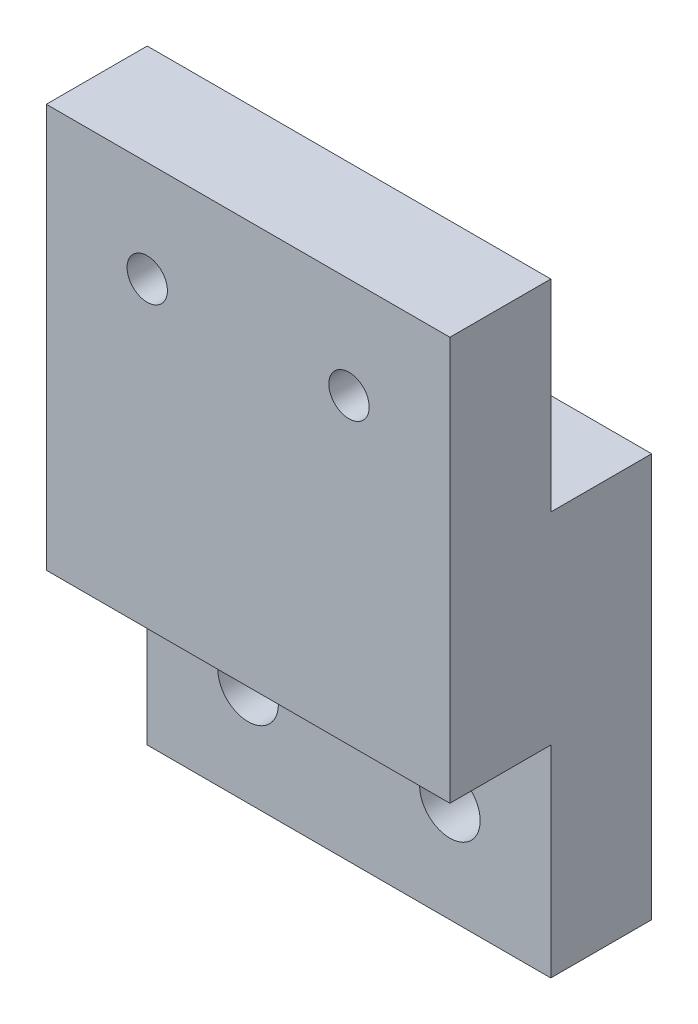
ISO-10303-21;
HEADER;
FILE_DESCRIPTION(('STEP AP214'),'2;1');
FILE_NAME('part.step','',(''),(''),'','','');
FILE_SCHEMA(('AUTOMOTIVE_DESIGN { 1 0 10303 214 1 1 1 1 }'));
ENDSEC;
DATA;
#1=APPLICATION_CONTEXT('core data for automotive mechanical design processes');
#2=APPLICATION_PROTOCOL_DEFINITION('international standard','automotive_design',2000,#1);
#3=PRODUCT_CONTEXT('',#1,'mechanical');
#4=PRODUCT('Part','Part','',(#3));
#5=PRODUCT_RELATED_PRODUCT_CATEGORY('part','',(#4));
#6=PRODUCT_DEFINITION_FORMATION('','',#4);
#7=PRODUCT_DEFINITION_CONTEXT('part definition',#1,'design');
#8=PRODUCT_DEFINITION('design','',#6,#7);
#9=PRODUCT_DEFINITION_SHAPE('','',#8);
#10=(LENGTH_UNIT() NAMED_UNIT(*) SI_UNIT(.MILLI.,.METRE.));
#11=(NAMED_UNIT(*) PLANE_ANGLE_UNIT() SI_UNIT($,.RADIAN.));
#12=(NAMED_UNIT(*) SI_UNIT($,.STERADIAN.) SOLID_ANGLE_UNIT());
#13=UNCERTAINTY_MEASURE_WITH_UNIT(LENGTH_MEASURE(1.E-05),#10,'distance_accuracy_value','');
#14=(GEOMETRIC_REPRESENTATION_CONTEXT(3) GLOBAL_UNCERTAINTY_ASSIGNED_CONTEXT((#13)) GLOBAL_UNIT_ASSIGNED_CONTEXT((#10,
#11,#12)) REPRESENTATION_CONTEXT('',''));
#15=CARTESIAN_POINT('',(0.,0.,0.));
#16=DIRECTION('',(0.,0.,1.));
#17=DIRECTION('',(1.,0.,0.));
#18=AXIS2_PLACEMENT_3D('',#15,#16,#17);
#19=CARTESIAN_POINT('',(-9.99999999999999,5.,5.));
#20=DIRECTION('',(1.,0.,0.));
#21=DIRECTION('',(0.,1.,0.));
#22=AXIS2_PLACEMENT_3D('',#19,#20,#21);
#23=PLANE('',#22);
#24=DIRECTION('',(0.,-1.,0.));
#25=VECTOR('',#24,1.);
#26=CARTESIAN_POINT('',(-9.99999999999999,5.,0.));
#27=LINE('',#26,#25);
#28=CARTESIAN_POINT('',(-9.99999999999999,5.,0.));
#29=VERTEX_POINT('',#28);
#30=CARTESIAN_POINT('',(-9.99999999999999,-5.,0.));
#31=VERTEX_POINT('',#30);
#32=EDGE_CURVE('E171',#29,#31,#27,.T.);
#33=ORIENTED_EDGE('',*,*,#32,.T.);
#34=DIRECTION('',(0.,0.,1.));
#35=VECTOR('',#34,1.);
#36=CARTESIAN_POINT('',(-9.99999999999999,-5.,-5.));
#37=LINE('',#36,#35);
#38=CARTESIAN_POINT('',(-9.99999999999999,-5.,-5.));
#39=VERTEX_POINT('',#38);
#40=EDGE_CURVE('E106',#39,#31,#37,.T.);
#41=ORIENTED_EDGE('',*,*,#40,.F.);
#42=DIRECTION('',(0.,1.,0.));
#43=VECTOR('',#42,1.);
#44=CARTESIAN_POINT('',(-9.99999999999999,-15.,-5.));
#45=LINE('',#44,#43);
#46=CARTESIAN_POINT('',(-9.99999999999998,-25.,-5.));
#47=VERTEX_POINT('',#46);
#48=EDGE_CURVE('E100',#47,#39,#45,.T.);
#49=ORIENTED_EDGE('',*,*,#48,.F.);
#50=DIRECTION('',(0.,0.,-1.));
#51=VECTOR('',#50,1.);
#52=CARTESIAN_POINT('',(-9.99999999999998,-25.,-5.));
#53=LINE('',#52,#51);
#54=CARTESIAN_POINT('',(-9.99999999999998,-25.,0.));
#55=VERTEX_POINT('',#54);
#56=EDGE_CURVE('E104',#55,#47,#53,.T.);
#57=ORIENTED_EDGE('',*,*,#56,.F.);
#58=DIRECTION('',(0.,1.,0.));
#59=VECTOR('',#58,1.);
#60=CARTESIAN_POINT('',(-9.99999999999998,-25.,0.));
#61=LINE('',#60,#59);
#62=CARTESIAN_POINT('',(-9.99999999999999,-15.,0.));
#63=VERTEX_POINT('',#62);
#64=EDGE_CURVE('E131',#55,#63,#61,.T.);
#65=ORIENTED_EDGE('',*,*,#64,.T.);
#66=DIRECTION('',(0.,0.,-1.));
#67=VECTOR('',#66,1.);
#68=CARTESIAN_POINT('',(-9.99999999999999,-15.,5.));
#69=LINE('',#68,#67);
#70=CARTESIAN_POINT('',(-9.99999999999999,-15.,5.));
#71=VERTEX_POINT('',#70);
#72=EDGE_CURVE('E160',#71,#63,#69,.T.);
#73=ORIENTED_EDGE('',*,*,#72,.F.);
#74=DIRECTION('',(0.,-1.,0.));
#75=VECTOR('',#74,1.);
#76=CARTESIAN_POINT('',(-9.99999999999999,5.,5.));
#77=LINE('',#76,#75);
#78=CARTESIAN_POINT('',(-9.99999999999999,5.,5.));
#79=VERTEX_POINT('',#78);
#80=EDGE_CURVE('E172',#79,#71,#77,.T.);
#81=ORIENTED_EDGE('',*,*,#80,.F.);
#82=DIRECTION('',(0.,0.,-1.));
#83=VECTOR('',#82,1.);
#84=CARTESIAN_POINT('',(-9.99999999999999,5.,5.));
#85=LINE('',#84,#83);
#86=EDGE_CURVE('E40',#79,#29,#85,.T.);
#87=ORIENTED_EDGE('',*,*,#86,.T.);
#88=EDGE_LOOP('',(#33,#41,#49,#57,#65,#73,#81,#87));
#89=FACE_BOUND('',#88,.T.);
#90=ADVANCED_FACE('F32',(#89),#23,.F.);
#91=CARTESIAN_POINT('',(10.,5.,5.));
#92=DIRECTION('',(-1.,0.,0.));
#93=DIRECTION('',(0.,-1.,0.));
#94=AXIS2_PLACEMENT_3D('',#91,#92,#93);
#95=PLANE('',#94);
#96=DIRECTION('',(0.,0.,1.));
#97=VECTOR('',#96,1.);
#98=CARTESIAN_POINT('',(10.,-15.,5.));
#99=LINE('',#98,#97);
#100=CARTESIAN_POINT('',(10.,-15.,0.));
#101=VERTEX_POINT('',#100);
#102=CARTESIAN_POINT('',(10.,-15.,5.));
#103=VERTEX_POINT('',#102);
#104=EDGE_CURVE('E138',#101,#103,#99,.T.);
#105=ORIENTED_EDGE('',*,*,#104,.F.);
#106=DIRECTION('',(0.,1.,0.));
#107=VECTOR('',#106,1.);
#108=CARTESIAN_POINT('',(10.,-25.,0.));
#109=LINE('',#108,#107);
#110=CARTESIAN_POINT('',(10.,-25.,0.));
#111=VERTEX_POINT('',#110);
#112=EDGE_CURVE('E142',#111,#101,#109,.T.);
#113=ORIENTED_EDGE('',*,*,#112,.F.);
#114=DIRECTION('',(0.,0.,1.));
#115=VECTOR('',#114,1.);
#116=CARTESIAN_POINT('',(10.,-25.,-5.));
#117=LINE('',#116,#115);
#118=CARTESIAN_POINT('',(10.,-25.,-5.));
#119=VERTEX_POINT('',#118);
#120=EDGE_CURVE('E117',#119,#111,#117,.T.);
#121=ORIENTED_EDGE('',*,*,#120,.F.);
#122=DIRECTION('',(0.,-1.,0.));
#123=VECTOR('',#122,1.);
#124=CARTESIAN_POINT('',(10.,-15.,-5.));
#125=LINE('',#124,#123);
#126=CARTESIAN_POINT('',(10.,-5.,-5.));
#127=VERTEX_POINT('',#126);
#128=EDGE_CURVE('E114',#127,#119,#125,.T.);
#129=ORIENTED_EDGE('',*,*,#128,.F.);
#130=DIRECTION('',(0.,0.,1.));
#131=VECTOR('',#130,1.);
#132=CARTESIAN_POINT('',(10.,-5.,-5.));
#133=LINE('',#132,#131);
#134=CARTESIAN_POINT('',(10.,-5.,0.));
#135=VERTEX_POINT('',#134);
#136=EDGE_CURVE('E189',#127,#135,#133,.T.);
#137=ORIENTED_EDGE('',*,*,#136,.T.);
#138=DIRECTION('',(0.,1.,0.));
#139=VECTOR('',#138,1.);
#140=CARTESIAN_POINT('',(10.,5.,0.));
#141=LINE('',#140,#139);
#142=CARTESIAN_POINT('',(10.,5.,0.));
#143=VERTEX_POINT('',#142);
#144=EDGE_CURVE('E185',#135,#143,#141,.T.);
#145=ORIENTED_EDGE('',*,*,#144,.T.);
#146=DIRECTION('',(0.,0.,-1.));
#147=VECTOR('',#146,1.);
#148=CARTESIAN_POINT('',(10.,5.,5.));
#149=LINE('',#148,#147);
#150=CARTESIAN_POINT('',(10.,5.,5.));
#151=VERTEX_POINT('',#150);
#152=EDGE_CURVE('E11',#151,#143,#149,.T.);
#153=ORIENTED_EDGE('',*,*,#152,.F.);
#154=DIRECTION('',(0.,1.,0.));
#155=VECTOR('',#154,1.);
#156=CARTESIAN_POINT('',(10.,5.,5.));
#157=LINE('',#156,#155);
#158=EDGE_CURVE('E174',#103,#151,#157,.T.);
#159=ORIENTED_EDGE('',*,*,#158,.F.);
#160=EDGE_LOOP('',(#105,#113,#121,#129,#137,#145,#153,#159));
#161=FACE_BOUND('',#160,.T.);
#162=ADVANCED_FACE('F200',(#161),#95,.F.);
#163=CARTESIAN_POINT('',(10.,5.,5.));
#164=DIRECTION('',(0.,-1.,0.));
#165=DIRECTION('',(1.,0.,0.));
#166=AXIS2_PLACEMENT_3D('',#163,#164,#165);
#167=PLANE('',#166);
#168=DIRECTION('',(-1.,0.,0.));
#169=VECTOR('',#168,1.);
#170=CARTESIAN_POINT('',(10.,5.,0.));
#171=LINE('',#170,#169);
#172=EDGE_CURVE('E175',#143,#29,#171,.T.);
#173=ORIENTED_EDGE('',*,*,#172,.T.);
#174=ORIENTED_EDGE('',*,*,#86,.F.);
#175=DIRECTION('',(-1.,0.,0.));
#176=VECTOR('',#175,1.);
#177=CARTESIAN_POINT('',(10.,5.,5.));
#178=LINE('',#177,#176);
#179=EDGE_CURVE('E177',#151,#79,#178,.T.);
#180=ORIENTED_EDGE('',*,*,#179,.F.);
#181=ORIENTED_EDGE('',*,*,#152,.T.);
#182=EDGE_LOOP('',(#173,#174,#180,#181));
#183=FACE_BOUND('',#182,.T.);
#184=ADVANCED_FACE('F214',(#183),#167,.F.);
#185=CARTESIAN_POINT('',(0.,0.,5.));
#186=DIRECTION('',(0.,0.,-1.));
#187=DIRECTION('',(-1.,0.,0.));
#188=AXIS2_PLACEMENT_3D('',#185,#186,#187);
#189=PLANE('',#188);
#190=CARTESIAN_POINT('',(5.00000000000001,0.,5.));
#191=DIRECTION('',(0.,0.,1.));
#192=DIRECTION('',(1.,0.,0.));
#193=AXIS2_PLACEMENT_3D('',#190,#191,#192);
#194=CIRCLE('',#193,1.);
#195=CARTESIAN_POINT('',(6.00000000000001,0.,5.));
#196=VERTEX_POINT('',#195);
#197=EDGE_CURVE('E134',#196,#196,#194,.T.);
#198=ORIENTED_EDGE('',*,*,#197,.F.);
#199=EDGE_LOOP('',(#198));
#200=FACE_BOUND('',#199,.T.);
#201=CARTESIAN_POINT('',(-4.99999999999999,0.,5.));
#202=DIRECTION('',(0.,0.,1.));
#203=DIRECTION('',(1.,0.,0.));
#204=AXIS2_PLACEMENT_3D('',#201,#202,#203);
#205=CIRCLE('',#204,1.);
#206=CARTESIAN_POINT('',(-3.99999999999999,0.,5.));
#207=VERTEX_POINT('',#206);
#208=EDGE_CURVE('E152',#207,#207,#205,.T.);
#209=ORIENTED_EDGE('',*,*,#208,.F.);
#210=EDGE_LOOP('',(#209));
#211=FACE_BOUND('',#210,.T.);
#212=ORIENTED_EDGE('',*,*,#80,.T.);
#213=DIRECTION('',(-1.,0.,0.));
#214=VECTOR('',#213,1.);
#215=CARTESIAN_POINT('',(-9.99999999999999,-15.,5.));
#216=LINE('',#215,#214);
#217=EDGE_CURVE('E168',#103,#71,#216,.T.);
#218=ORIENTED_EDGE('',*,*,#217,.F.);
#219=ORIENTED_EDGE('',*,*,#158,.T.);
#220=ORIENTED_EDGE('',*,*,#179,.T.);
#221=EDGE_LOOP('',(#212,#218,#219,#220));
#222=FACE_BOUND('',#221,.T.);
#223=ADVANCED_FACE('F209',(#200,#211,#222),#189,.F.);
#224=CARTESIAN_POINT('',(0.,0.,0.));
#225=DIRECTION('',(0.,0.,-1.));
#226=DIRECTION('',(-1.,0.,0.));
#227=AXIS2_PLACEMENT_3D('',#224,#225,#226);
#228=PLANE('',#227);
#229=CARTESIAN_POINT('',(5.00000000000001,0.,0.));
#230=DIRECTION('',(0.,0.,-1.));
#231=DIRECTION('',(-1.,0.,0.));
#232=AXIS2_PLACEMENT_3D('',#229,#230,#231);
#233=CIRCLE('',#232,1.);
#234=CARTESIAN_POINT('',(4.00000000000001,0.,0.));
#235=VERTEX_POINT('',#234);
#236=EDGE_CURVE('E148',#235,#235,#233,.T.);
#237=ORIENTED_EDGE('',*,*,#236,.F.);
#238=EDGE_LOOP('',(#237));
#239=FACE_BOUND('',#238,.T.);
#240=CARTESIAN_POINT('',(-4.99999999999999,0.,0.));
#241=DIRECTION('',(0.,0.,-1.));
#242=DIRECTION('',(-1.,0.,0.));
#243=AXIS2_PLACEMENT_3D('',#240,#241,#242);
#244=CIRCLE('',#243,1.);
#245=CARTESIAN_POINT('',(-5.99999999999999,0.,0.));
#246=VERTEX_POINT('',#245);
#247=EDGE_CURVE('E157',#246,#246,#244,.T.);
#248=ORIENTED_EDGE('',*,*,#247,.F.);
#249=EDGE_LOOP('',(#248));
#250=FACE_BOUND('',#249,.T.);
#251=DIRECTION('',(1.,0.,0.));
#252=VECTOR('',#251,1.);
#253=CARTESIAN_POINT('',(-9.99999999999999,-5.,0.));
#254=LINE('',#253,#252);
#255=EDGE_CURVE('E56',#31,#135,#254,.T.);
#256=ORIENTED_EDGE('',*,*,#255,.F.);
#257=ORIENTED_EDGE('',*,*,#32,.F.);
#258=ORIENTED_EDGE('',*,*,#172,.F.);
#259=ORIENTED_EDGE('',*,*,#144,.F.);
#260=EDGE_LOOP('',(#256,#257,#258,#259));
#261=FACE_BOUND('',#260,.T.);
#262=ADVANCED_FACE('F216',(#239,#250,#261),#228,.T.);
#263=CARTESIAN_POINT('',(0.,-15.,0.));
#264=DIRECTION('',(0.,-1.,0.));
#265=DIRECTION('',(1.,0.,0.));
#266=AXIS2_PLACEMENT_3D('',#263,#264,#265);
#267=PLANE('',#266);
#268=DIRECTION('',(-1.,0.,0.));
#269=VECTOR('',#268,1.);
#270=CARTESIAN_POINT('',(-9.99999999999999,-15.,0.));
#271=LINE('',#270,#269);
#272=EDGE_CURVE('E48',#101,#63,#271,.T.);
#273=ORIENTED_EDGE('',*,*,#272,.F.);
#274=ORIENTED_EDGE('',*,*,#104,.T.);
#275=ORIENTED_EDGE('',*,*,#217,.T.);
#276=ORIENTED_EDGE('',*,*,#72,.T.);
#277=EDGE_LOOP('',(#273,#274,#275,#276));
#278=FACE_BOUND('',#277,.T.);
#279=ADVANCED_FACE('F206',(#278),#267,.T.);
#280=CARTESIAN_POINT('',(-9.99999999999999,-5.,-5.));
#281=DIRECTION('',(0.,-1.,0.));
#282=DIRECTION('',(0.,0.,-1.));
#283=AXIS2_PLACEMENT_3D('',#280,#281,#282);
#284=PLANE('',#283);
#285=ORIENTED_EDGE('',*,*,#255,.T.);
#286=ORIENTED_EDGE('',*,*,#136,.F.);
#287=DIRECTION('',(1.,0.,0.));
#288=VECTOR('',#287,1.);
#289=CARTESIAN_POINT('',(-9.99999999999999,-5.,-5.));
#290=LINE('',#289,#288);
#291=EDGE_CURVE('E108',#39,#127,#290,.T.);
#292=ORIENTED_EDGE('',*,*,#291,.F.);
#293=ORIENTED_EDGE('',*,*,#40,.T.);
#294=EDGE_LOOP('',(#285,#286,#292,#293));
#295=FACE_BOUND('',#294,.T.);
#296=ADVANCED_FACE('F196',(#295),#284,.F.);
#297=CARTESIAN_POINT('',(0.,0.,-5.));
#298=DIRECTION('',(0.,0.,-1.));
#299=DIRECTION('',(-1.,0.,0.));
#300=AXIS2_PLACEMENT_3D('',#297,#298,#299);
#301=PLANE('',#300);
#302=CARTESIAN_POINT('',(5.,-20.,-5.));
#303=DIRECTION('',(0.,0.,-1.));
#304=DIRECTION('',(-1.,0.,0.));
#305=AXIS2_PLACEMENT_3D('',#302,#303,#304);
#306=CIRCLE('',#305,1.5);
#307=CARTESIAN_POINT('',(3.5,-20.,-5.));
#308=VERTEX_POINT('',#307);
#309=EDGE_CURVE('E345',#308,#308,#306,.T.);
#310=ORIENTED_EDGE('',*,*,#309,.F.);
#311=EDGE_LOOP('',(#310));
#312=FACE_BOUND('',#311,.T.);
#313=CARTESIAN_POINT('',(-5.,-20.,-5.));
#314=DIRECTION('',(0.,0.,-1.));
#315=DIRECTION('',(-1.,0.,0.));
#316=AXIS2_PLACEMENT_3D('',#313,#314,#315);
#317=CIRCLE('',#316,1.5);
#318=CARTESIAN_POINT('',(-6.5,-20.,-5.));
#319=VERTEX_POINT('',#318);
#320=EDGE_CURVE('E124',#319,#319,#317,.T.);
#321=ORIENTED_EDGE('',*,*,#320,.F.);
#322=EDGE_LOOP('',(#321));
#323=FACE_BOUND('',#322,.T.);
#324=ORIENTED_EDGE('',*,*,#48,.T.);
#325=ORIENTED_EDGE('',*,*,#291,.T.);
#326=ORIENTED_EDGE('',*,*,#128,.T.);
#327=DIRECTION('',(1.,0.,0.));
#328=VECTOR('',#327,1.);
#329=CARTESIAN_POINT('',(-9.99999999999998,-25.,-5.));
#330=LINE('',#329,#328);
#331=EDGE_CURVE('E111',#47,#119,#330,.T.);
#332=ORIENTED_EDGE('',*,*,#331,.F.);
#333=EDGE_LOOP('',(#324,#325,#326,#332));
#334=FACE_BOUND('',#333,.T.);
#335=ADVANCED_FACE('F112',(#312,#323,#334),#301,.T.);
#336=CARTESIAN_POINT('',(-4.99999999999999,0.,-5.));
#337=DIRECTION('',(0.,0.,1.));
#338=DIRECTION('',(1.,0.,0.));
#339=AXIS2_PLACEMENT_3D('',#336,#337,#338);
#340=CYLINDRICAL_SURFACE('',#339,1.);
#341=ORIENTED_EDGE('',*,*,#247,.T.);
#342=EDGE_LOOP('',(#341));
#343=FACE_BOUND('',#342,.T.);
#344=ORIENTED_EDGE('',*,*,#208,.T.);
#345=EDGE_LOOP('',(#344));
#346=FACE_BOUND('',#345,.T.);
#347=ADVANCED_FACE('F259',(#343,#346),#340,.F.);
#348=CARTESIAN_POINT('',(5.00000000000001,0.,-5.));
#349=DIRECTION('',(0.,0.,1.));
#350=DIRECTION('',(1.,0.,0.));
#351=AXIS2_PLACEMENT_3D('',#348,#349,#350);
#352=CYLINDRICAL_SURFACE('',#351,1.);
#353=ORIENTED_EDGE('',*,*,#236,.T.);
#354=EDGE_LOOP('',(#353));
#355=FACE_BOUND('',#354,.T.);
#356=ORIENTED_EDGE('',*,*,#197,.T.);
#357=EDGE_LOOP('',(#356));
#358=FACE_BOUND('',#357,.T.);
#359=ADVANCED_FACE('F264',(#355,#358),#352,.F.);
#360=CARTESIAN_POINT('',(-9.99999999999998,-25.,0.));
#361=DIRECTION('',(0.,0.,-1.));
#362=DIRECTION('',(-1.,0.,0.));
#363=AXIS2_PLACEMENT_3D('',#360,#361,#362);
#364=PLANE('',#363);
#365=CARTESIAN_POINT('',(5.,-20.,0.));
#366=DIRECTION('',(0.,0.,1.));
#367=DIRECTION('',(1.,0.,0.));
#368=AXIS2_PLACEMENT_3D('',#365,#366,#367);
#369=CIRCLE('',#368,1.5);
#370=CARTESIAN_POINT('',(6.5,-20.,0.));
#371=VERTEX_POINT('',#370);
#372=EDGE_CURVE('E348',#371,#371,#369,.T.);
#373=ORIENTED_EDGE('',*,*,#372,.F.);
#374=EDGE_LOOP('',(#373));
#375=FACE_BOUND('',#374,.T.);
#376=CARTESIAN_POINT('',(-5.,-20.,0.));
#377=DIRECTION('',(0.,0.,1.));
#378=DIRECTION('',(1.,0.,0.));
#379=AXIS2_PLACEMENT_3D('',#376,#377,#378);
#380=CIRCLE('',#379,1.5);
#381=CARTESIAN_POINT('',(-3.5,-20.,0.));
#382=VERTEX_POINT('',#381);
#383=EDGE_CURVE('E350',#382,#382,#380,.T.);
#384=ORIENTED_EDGE('',*,*,#383,.F.);
#385=EDGE_LOOP('',(#384));
#386=FACE_BOUND('',#385,.T.);
#387=ORIENTED_EDGE('',*,*,#272,.T.);
#388=ORIENTED_EDGE('',*,*,#64,.F.);
#389=DIRECTION('',(-1.,0.,0.));
#390=VECTOR('',#389,1.);
#391=CARTESIAN_POINT('',(-9.99999999999998,-25.,0.));
#392=LINE('',#391,#390);
#393=EDGE_CURVE('E121',#111,#55,#392,.T.);
#394=ORIENTED_EDGE('',*,*,#393,.F.);
#395=ORIENTED_EDGE('',*,*,#112,.T.);
#396=EDGE_LOOP('',(#387,#388,#394,#395));
#397=FACE_BOUND('',#396,.T.);
#398=ADVANCED_FACE('F202',(#375,#386,#397),#364,.F.);
#399=CARTESIAN_POINT('',(0.,-25.,0.));
#400=DIRECTION('',(0.,1.,0.));
#401=DIRECTION('',(-1.,0.,0.));
#402=AXIS2_PLACEMENT_3D('',#399,#400,#401);
#403=PLANE('',#402);
#404=ORIENTED_EDGE('',*,*,#56,.T.);
#405=ORIENTED_EDGE('',*,*,#331,.T.);
#406=ORIENTED_EDGE('',*,*,#120,.T.);
#407=ORIENTED_EDGE('',*,*,#393,.T.);
#408=EDGE_LOOP('',(#404,#405,#406,#407));
#409=FACE_BOUND('',#408,.T.);
#410=ADVANCED_FACE('F119',(#409),#403,.F.);
#411=CARTESIAN_POINT('',(-5.,-20.,-10.));
#412=DIRECTION('',(0.,0.,1.));
#413=DIRECTION('',(1.,0.,0.));
#414=AXIS2_PLACEMENT_3D('',#411,#412,#413);
#415=CYLINDRICAL_SURFACE('',#414,1.5);
#416=ORIENTED_EDGE('',*,*,#320,.T.);
#417=EDGE_LOOP('',(#416));
#418=FACE_BOUND('',#417,.T.);
#419=ORIENTED_EDGE('',*,*,#383,.T.);
#420=EDGE_LOOP('',(#419));
#421=FACE_BOUND('',#420,.T.);
#422=ADVANCED_FACE('F302',(#418,#421),#415,.F.);
#423=CARTESIAN_POINT('',(5.,-20.,-10.));
#424=DIRECTION('',(0.,0.,1.));
#425=DIRECTION('',(1.,0.,0.));
#426=AXIS2_PLACEMENT_3D('',#423,#424,#425);
#427=CYLINDRICAL_SURFACE('',#426,1.5);
#428=ORIENTED_EDGE('',*,*,#309,.T.);
#429=EDGE_LOOP('',(#428));
#430=FACE_BOUND('',#429,.T.);
#431=ORIENTED_EDGE('',*,*,#372,.T.);
#432=EDGE_LOOP('',(#431));
#433=FACE_BOUND('',#432,.T.);
#434=ADVANCED_FACE('F326',(#430,#433),#427,.F.);
#435=CLOSED_SHELL('',(#90,#162,#184,#223,#262,#279,#296,#335,#347,#359,#398,#410,#422,#434));
#436=MANIFOLD_SOLID_BREP('B2',#435);
#437=ADVANCED_BREP_SHAPE_REPRESENTATION('',(#18,#436),#14);
#438=SHAPE_DEFINITION_REPRESENTATION(#9,#437);
ENDSEC;
END-ISO-10303-21;
